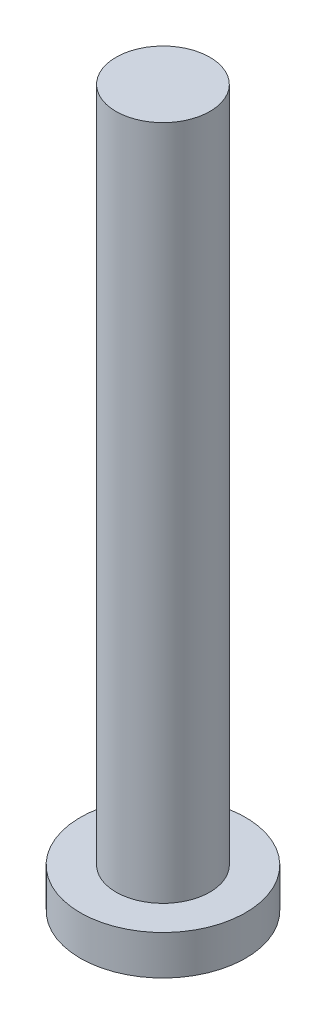
ISO-10303-21;
HEADER;
FILE_DESCRIPTION(('STEP AP214'),'2;1');
FILE_NAME('part.step','',(''),(''),'','','');
FILE_SCHEMA(('AUTOMOTIVE_DESIGN { 1 0 10303 214 1 1 1 1 }'));
ENDSEC;
DATA;
#1=APPLICATION_CONTEXT('core data for automotive mechanical design processes');
#2=APPLICATION_PROTOCOL_DEFINITION('international standard','automotive_design',2000,#1);
#3=PRODUCT_CONTEXT('',#1,'mechanical');
#4=PRODUCT('Part','Part','',(#3));
#5=PRODUCT_RELATED_PRODUCT_CATEGORY('part','',(#4));
#6=PRODUCT_DEFINITION_FORMATION('','',#4);
#7=PRODUCT_DEFINITION_CONTEXT('part definition',#1,'design');
#8=PRODUCT_DEFINITION('design','',#6,#7);
#9=PRODUCT_DEFINITION_SHAPE('','',#8);
#10=(LENGTH_UNIT() NAMED_UNIT(*) SI_UNIT(.MILLI.,.METRE.));
#11=(NAMED_UNIT(*) PLANE_ANGLE_UNIT() SI_UNIT($,.RADIAN.));
#12=(NAMED_UNIT(*) SI_UNIT($,.STERADIAN.) SOLID_ANGLE_UNIT());
#13=UNCERTAINTY_MEASURE_WITH_UNIT(LENGTH_MEASURE(1.E-05),#10,'distance_accuracy_value','');
#14=(GEOMETRIC_REPRESENTATION_CONTEXT(3) GLOBAL_UNCERTAINTY_ASSIGNED_CONTEXT((#13)) GLOBAL_UNIT_ASSIGNED_CONTEXT((#10,
#11,#12)) REPRESENTATION_CONTEXT('',''));
#15=CARTESIAN_POINT('',(0.,0.,0.));
#16=DIRECTION('',(0.,0.,1.));
#17=DIRECTION('',(1.,0.,0.));
#18=AXIS2_PLACEMENT_3D('',#15,#16,#17);
#19=CARTESIAN_POINT('',(0.,2.1,0.));
#20=DIRECTION('',(0.,-1.,0.));
#21=DIRECTION('',(0.,0.,-1.));
#22=AXIS2_PLACEMENT_3D('',#19,#20,#21);
#23=CYLINDRICAL_SURFACE('',#22,4.4);
#24=CARTESIAN_POINT('',(0.,2.1,0.));
#25=DIRECTION('',(0.,1.,0.));
#26=DIRECTION('',(0.,0.,1.));
#27=AXIS2_PLACEMENT_3D('',#24,#25,#26);
#28=CIRCLE('',#27,4.4);
#29=CARTESIAN_POINT('',(0.,2.1,4.4));
#30=VERTEX_POINT('',#29);
#31=EDGE_CURVE('E64',#30,#30,#28,.T.);
#32=ORIENTED_EDGE('',*,*,#31,.F.);
#33=EDGE_LOOP('',(#32));
#34=FACE_BOUND('',#33,.T.);
#35=CARTESIAN_POINT('',(0.,0.,0.));
#36=DIRECTION('',(0.,1.,0.));
#37=DIRECTION('',(0.,0.,1.));
#38=AXIS2_PLACEMENT_3D('',#35,#36,#37);
#39=CIRCLE('',#38,4.4);
#40=CARTESIAN_POINT('',(0.,0.,4.4));
#41=VERTEX_POINT('',#40);
#42=EDGE_CURVE('E58',#41,#41,#39,.T.);
#43=ORIENTED_EDGE('',*,*,#42,.T.);
#44=EDGE_LOOP('',(#43));
#45=FACE_BOUND('',#44,.T.);
#46=ADVANCED_FACE('F55',(#34,#45),#23,.T.);
#47=CARTESIAN_POINT('',(0.,2.1,0.));
#48=DIRECTION('',(0.,1.,0.));
#49=DIRECTION('',(0.,0.,1.));
#50=AXIS2_PLACEMENT_3D('',#47,#48,#49);
#51=PLANE('',#50);
#52=CARTESIAN_POINT('',(0.,2.1,0.));
#53=DIRECTION('',(0.,1.,0.));
#54=DIRECTION('',(0.,0.,1.));
#55=AXIS2_PLACEMENT_3D('',#52,#53,#54);
#56=CIRCLE('',#55,2.5);
#57=CARTESIAN_POINT('',(0.,2.1,2.5));
#58=VERTEX_POINT('',#57);
#59=EDGE_CURVE('E11',#58,#58,#56,.T.);
#60=ORIENTED_EDGE('',*,*,#59,.F.);
#61=EDGE_LOOP('',(#60));
#62=FACE_BOUND('',#61,.T.);
#63=ORIENTED_EDGE('',*,*,#31,.T.);
#64=EDGE_LOOP('',(#63));
#65=FACE_BOUND('',#64,.T.);
#66=ADVANCED_FACE('F192',(#62,#65),#51,.T.);
#67=CARTESIAN_POINT('',(0.,0.,0.));
#68=DIRECTION('',(0.,1.,0.));
#69=DIRECTION('',(0.,0.,1.));
#70=AXIS2_PLACEMENT_3D('',#67,#68,#69);
#71=PLANE('',#70);
#72=DIRECTION('',(-0.5,0.,0.866025403784439));
#73=VECTOR('',#72,1.);
#74=CARTESIAN_POINT('',(2.88675134594813,0.,0.));
#75=LINE('',#74,#73);
#76=CARTESIAN_POINT('',(2.88675134594813,0.,0.));
#77=VERTEX_POINT('',#76);
#78=CARTESIAN_POINT('',(1.44337567297406,0.,2.5));
#79=VERTEX_POINT('',#78);
#80=EDGE_CURVE('E152',#77,#79,#75,.T.);
#81=ORIENTED_EDGE('',*,*,#80,.F.);
#82=DIRECTION('',(0.5,0.,0.866025403784439));
#83=VECTOR('',#82,1.);
#84=CARTESIAN_POINT('',(1.44337567297406,0.,-2.5));
#85=LINE('',#84,#83);
#86=CARTESIAN_POINT('',(1.44337567297406,0.,-2.5));
#87=VERTEX_POINT('',#86);
#88=EDGE_CURVE('E72',#87,#77,#85,.T.);
#89=ORIENTED_EDGE('',*,*,#88,.F.);
#90=DIRECTION('',(1.,0.,0.));
#91=VECTOR('',#90,1.);
#92=CARTESIAN_POINT('',(-1.44337567297407,0.,-2.5));
#93=LINE('',#92,#91);
#94=CARTESIAN_POINT('',(-1.44337567297407,0.,-2.5));
#95=VERTEX_POINT('',#94);
#96=EDGE_CURVE('E166',#95,#87,#93,.T.);
#97=ORIENTED_EDGE('',*,*,#96,.F.);
#98=DIRECTION('',(0.5,0.,-0.866025403784439));
#99=VECTOR('',#98,1.);
#100=CARTESIAN_POINT('',(-2.88675134594813,0.,0.));
#101=LINE('',#100,#99);
#102=CARTESIAN_POINT('',(-2.88675134594813,0.,0.));
#103=VERTEX_POINT('',#102);
#104=EDGE_CURVE('E163',#103,#95,#101,.T.);
#105=ORIENTED_EDGE('',*,*,#104,.F.);
#106=DIRECTION('',(-0.5,0.,-0.866025403784439));
#107=VECTOR('',#106,1.);
#108=CARTESIAN_POINT('',(-1.44337567297407,0.,2.5));
#109=LINE('',#108,#107);
#110=CARTESIAN_POINT('',(-1.44337567297407,0.,2.5));
#111=VERTEX_POINT('',#110);
#112=EDGE_CURVE('E120',#111,#103,#109,.T.);
#113=ORIENTED_EDGE('',*,*,#112,.F.);
#114=DIRECTION('',(-1.,0.,0.));
#115=VECTOR('',#114,1.);
#116=CARTESIAN_POINT('',(1.44337567297406,0.,2.5));
#117=LINE('',#116,#115);
#118=EDGE_CURVE('E157',#79,#111,#117,.T.);
#119=ORIENTED_EDGE('',*,*,#118,.F.);
#120=EDGE_LOOP('',(#81,#89,#97,#105,#113,#119));
#121=FACE_BOUND('',#120,.T.);
#122=ORIENTED_EDGE('',*,*,#42,.F.);
#123=EDGE_LOOP('',(#122));
#124=FACE_BOUND('',#123,.T.);
#125=ADVANCED_FACE('F189',(#121,#124),#71,.F.);
#126=CARTESIAN_POINT('',(1.44337567297406,1.27,-2.5));
#127=DIRECTION('',(0.866025403784439,0.,-0.5));
#128=DIRECTION('',(-0.5,0.,-0.866025403784439));
#129=AXIS2_PLACEMENT_3D('',#126,#127,#128);
#130=PLANE('',#129);
#131=ORIENTED_EDGE('',*,*,#88,.T.);
#132=DIRECTION('',(0.,-1.,0.));
#133=VECTOR('',#132,1.);
#134=CARTESIAN_POINT('',(2.88675134594813,1.27,0.));
#135=LINE('',#134,#133);
#136=CARTESIAN_POINT('',(2.88675134594813,1.27,0.));
#137=VERTEX_POINT('',#136);
#138=EDGE_CURVE('E102',#137,#77,#135,.T.);
#139=ORIENTED_EDGE('',*,*,#138,.F.);
#140=DIRECTION('',(0.5,0.,0.866025403784439));
#141=VECTOR('',#140,1.);
#142=CARTESIAN_POINT('',(1.44337567297406,1.27,-2.5));
#143=LINE('',#142,#141);
#144=CARTESIAN_POINT('',(1.44337567297406,1.27,-2.5));
#145=VERTEX_POINT('',#144);
#146=EDGE_CURVE('E169',#145,#137,#143,.T.);
#147=ORIENTED_EDGE('',*,*,#146,.F.);
#148=DIRECTION('',(0.,-1.,0.));
#149=VECTOR('',#148,1.);
#150=CARTESIAN_POINT('',(1.44337567297406,1.27,-2.5));
#151=LINE('',#150,#149);
#152=EDGE_CURVE('E80',#145,#87,#151,.T.);
#153=ORIENTED_EDGE('',*,*,#152,.T.);
#154=EDGE_LOOP('',(#131,#139,#147,#153));
#155=FACE_BOUND('',#154,.T.);
#156=ADVANCED_FACE('F191',(#155),#130,.F.);
#157=CARTESIAN_POINT('',(-1.44337567297407,1.27,-2.5));
#158=DIRECTION('',(0.,0.,-1.));
#159=DIRECTION('',(-1.,0.,0.));
#160=AXIS2_PLACEMENT_3D('',#157,#158,#159);
#161=PLANE('',#160);
#162=ORIENTED_EDGE('',*,*,#96,.T.);
#163=ORIENTED_EDGE('',*,*,#152,.F.);
#164=DIRECTION('',(1.,0.,0.));
#165=VECTOR('',#164,1.);
#166=CARTESIAN_POINT('',(-1.44337567297407,1.27,-2.5));
#167=LINE('',#166,#165);
#168=CARTESIAN_POINT('',(-1.44337567297407,1.27,-2.5));
#169=VERTEX_POINT('',#168);
#170=EDGE_CURVE('E134',#169,#145,#167,.T.);
#171=ORIENTED_EDGE('',*,*,#170,.F.);
#172=DIRECTION('',(0.,-1.,0.));
#173=VECTOR('',#172,1.);
#174=CARTESIAN_POINT('',(-1.44337567297407,1.27,-2.5));
#175=LINE('',#174,#173);
#176=EDGE_CURVE('E125',#169,#95,#175,.T.);
#177=ORIENTED_EDGE('',*,*,#176,.T.);
#178=EDGE_LOOP('',(#162,#163,#171,#177));
#179=FACE_BOUND('',#178,.T.);
#180=ADVANCED_FACE('F198',(#179),#161,.F.);
#181=CARTESIAN_POINT('',(-2.88675134594813,1.27,0.));
#182=DIRECTION('',(-0.866025403784439,0.,-0.5));
#183=DIRECTION('',(-0.5,0.,0.866025403784439));
#184=AXIS2_PLACEMENT_3D('',#181,#182,#183);
#185=PLANE('',#184);
#186=ORIENTED_EDGE('',*,*,#104,.T.);
#187=ORIENTED_EDGE('',*,*,#176,.F.);
#188=DIRECTION('',(0.5,0.,-0.866025403784439));
#189=VECTOR('',#188,1.);
#190=CARTESIAN_POINT('',(-2.88675134594813,1.27,0.));
#191=LINE('',#190,#189);
#192=CARTESIAN_POINT('',(-2.88675134594813,1.27,0.));
#193=VERTEX_POINT('',#192);
#194=EDGE_CURVE('E129',#193,#169,#191,.T.);
#195=ORIENTED_EDGE('',*,*,#194,.F.);
#196=DIRECTION('',(0.,-1.,0.));
#197=VECTOR('',#196,1.);
#198=CARTESIAN_POINT('',(-2.88675134594813,1.27,0.));
#199=LINE('',#198,#197);
#200=EDGE_CURVE('E113',#193,#103,#199,.T.);
#201=ORIENTED_EDGE('',*,*,#200,.T.);
#202=EDGE_LOOP('',(#186,#187,#195,#201));
#203=FACE_BOUND('',#202,.T.);
#204=ADVANCED_FACE('F130',(#203),#185,.F.);
#205=CARTESIAN_POINT('',(-1.44337567297407,1.27,2.5));
#206=DIRECTION('',(-0.866025403784439,0.,0.5));
#207=DIRECTION('',(0.5,0.,0.866025403784439));
#208=AXIS2_PLACEMENT_3D('',#205,#206,#207);
#209=PLANE('',#208);
#210=ORIENTED_EDGE('',*,*,#112,.T.);
#211=ORIENTED_EDGE('',*,*,#200,.F.);
#212=DIRECTION('',(-0.5,0.,-0.866025403784439));
#213=VECTOR('',#212,1.);
#214=CARTESIAN_POINT('',(-1.44337567297407,1.27,2.5));
#215=LINE('',#214,#213);
#216=CARTESIAN_POINT('',(-1.44337567297407,1.27,2.5));
#217=VERTEX_POINT('',#216);
#218=EDGE_CURVE('E117',#217,#193,#215,.T.);
#219=ORIENTED_EDGE('',*,*,#218,.F.);
#220=DIRECTION('',(0.,-1.,0.));
#221=VECTOR('',#220,1.);
#222=CARTESIAN_POINT('',(-1.44337567297407,1.27,2.5));
#223=LINE('',#222,#221);
#224=EDGE_CURVE('E126',#217,#111,#223,.T.);
#225=ORIENTED_EDGE('',*,*,#224,.T.);
#226=EDGE_LOOP('',(#210,#211,#219,#225));
#227=FACE_BOUND('',#226,.T.);
#228=ADVANCED_FACE('F115',(#227),#209,.F.);
#229=CARTESIAN_POINT('',(1.44337567297406,1.27,2.5));
#230=DIRECTION('',(0.,0.,1.));
#231=DIRECTION('',(1.,0.,0.));
#232=AXIS2_PLACEMENT_3D('',#229,#230,#231);
#233=PLANE('',#232);
#234=ORIENTED_EDGE('',*,*,#118,.T.);
#235=ORIENTED_EDGE('',*,*,#224,.F.);
#236=DIRECTION('',(-1.,0.,0.));
#237=VECTOR('',#236,1.);
#238=CARTESIAN_POINT('',(1.44337567297406,1.27,2.5));
#239=LINE('',#238,#237);
#240=CARTESIAN_POINT('',(1.44337567297406,1.27,2.5));
#241=VERTEX_POINT('',#240);
#242=EDGE_CURVE('E140',#241,#217,#239,.T.);
#243=ORIENTED_EDGE('',*,*,#242,.F.);
#244=DIRECTION('',(0.,-1.,0.));
#245=VECTOR('',#244,1.);
#246=CARTESIAN_POINT('',(1.44337567297406,1.27,2.5));
#247=LINE('',#246,#245);
#248=EDGE_CURVE('E176',#241,#79,#247,.T.);
#249=ORIENTED_EDGE('',*,*,#248,.T.);
#250=EDGE_LOOP('',(#234,#235,#243,#249));
#251=FACE_BOUND('',#250,.T.);
#252=ADVANCED_FACE('F251',(#251),#233,.F.);
#253=CARTESIAN_POINT('',(2.88675134594813,1.27,0.));
#254=DIRECTION('',(0.866025403784438,0.,0.5));
#255=DIRECTION('',(0.5,0.,-0.866025403784439));
#256=AXIS2_PLACEMENT_3D('',#253,#254,#255);
#257=PLANE('',#256);
#258=ORIENTED_EDGE('',*,*,#80,.T.);
#259=ORIENTED_EDGE('',*,*,#248,.F.);
#260=DIRECTION('',(-0.5,0.,0.866025403784439));
#261=VECTOR('',#260,1.);
#262=CARTESIAN_POINT('',(2.88675134594813,1.27,0.));
#263=LINE('',#262,#261);
#264=EDGE_CURVE('E144',#137,#241,#263,.T.);
#265=ORIENTED_EDGE('',*,*,#264,.F.);
#266=ORIENTED_EDGE('',*,*,#138,.T.);
#267=EDGE_LOOP('',(#258,#259,#265,#266));
#268=FACE_BOUND('',#267,.T.);
#269=ADVANCED_FACE('F260',(#268),#257,.F.);
#270=CARTESIAN_POINT('',(0.,1.27,0.));
#271=DIRECTION('',(0.,-1.,0.));
#272=DIRECTION('',(0.,0.,-1.));
#273=AXIS2_PLACEMENT_3D('',#270,#271,#272);
#274=PLANE('',#273);
#275=ORIENTED_EDGE('',*,*,#146,.T.);
#276=ORIENTED_EDGE('',*,*,#264,.T.);
#277=ORIENTED_EDGE('',*,*,#242,.T.);
#278=ORIENTED_EDGE('',*,*,#218,.T.);
#279=ORIENTED_EDGE('',*,*,#194,.T.);
#280=ORIENTED_EDGE('',*,*,#170,.T.);
#281=EDGE_LOOP('',(#275,#276,#277,#278,#279,#280));
#282=FACE_BOUND('',#281,.T.);
#283=ADVANCED_FACE('F137',(#282),#274,.T.);
#284=CARTESIAN_POINT('',(0.,38.1,0.));
#285=DIRECTION('',(0.,-1.,0.));
#286=DIRECTION('',(0.,0.,-1.));
#287=AXIS2_PLACEMENT_3D('',#284,#285,#286);
#288=CYLINDRICAL_SURFACE('',#287,2.5);
#289=CARTESIAN_POINT('',(0.,38.1,0.));
#290=DIRECTION('',(0.,1.,0.));
#291=DIRECTION('',(0.,0.,1.));
#292=AXIS2_PLACEMENT_3D('',#289,#290,#291);
#293=CIRCLE('',#292,2.5);
#294=CARTESIAN_POINT('',(0.,38.1,2.5));
#295=VERTEX_POINT('',#294);
#296=EDGE_CURVE('E153',#295,#295,#293,.T.);
#297=ORIENTED_EDGE('',*,*,#296,.F.);
#298=EDGE_LOOP('',(#297));
#299=FACE_BOUND('',#298,.T.);
#300=ORIENTED_EDGE('',*,*,#59,.T.);
#301=EDGE_LOOP('',(#300));
#302=FACE_BOUND('',#301,.T.);
#303=ADVANCED_FACE('F278',(#299,#302),#288,.T.);
#304=CARTESIAN_POINT('',(0.,38.1,0.));
#305=DIRECTION('',(0.,1.,0.));
#306=DIRECTION('',(0.,0.,1.));
#307=AXIS2_PLACEMENT_3D('',#304,#305,#306);
#308=PLANE('',#307);
#309=ORIENTED_EDGE('',*,*,#296,.T.);
#310=EDGE_LOOP('',(#309));
#311=FACE_BOUND('',#310,.T.);
#312=ADVANCED_FACE('F287',(#311),#308,.T.);
#313=CLOSED_SHELL('',(#46,#66,#125,#156,#180,#204,#228,#252,#269,#283,#303,#312));
#314=MANIFOLD_SOLID_BREP('B2',#313);
#315=ADVANCED_BREP_SHAPE_REPRESENTATION('',(#18,#314),#14);
#316=SHAPE_DEFINITION_REPRESENTATION(#9,#315);
ENDSEC;
END-ISO-10303-21;
